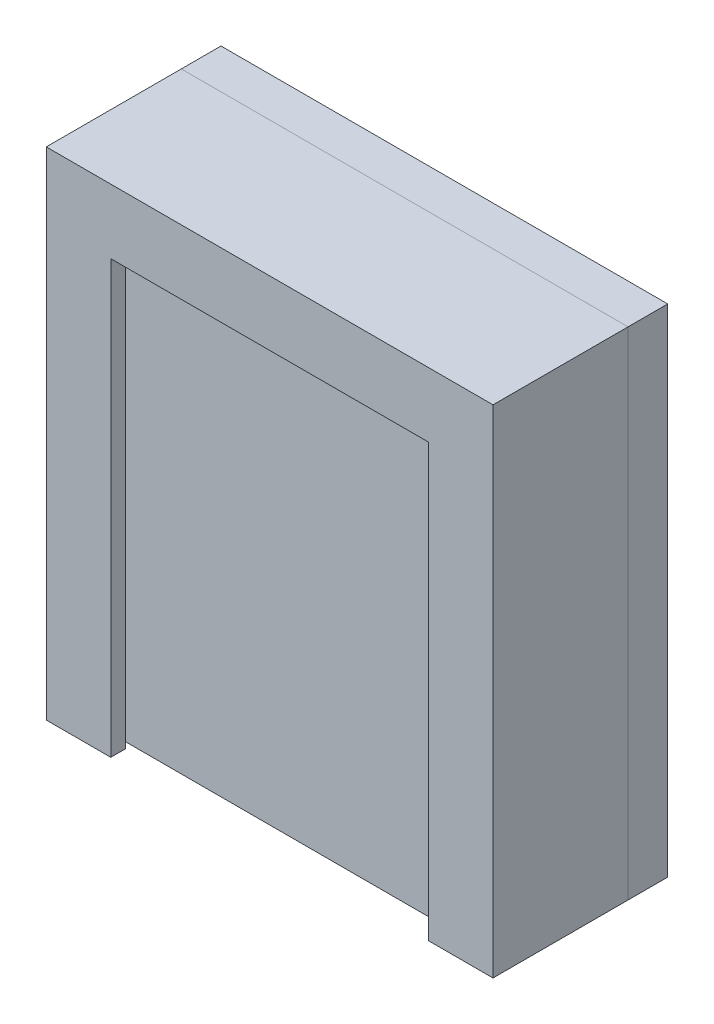
ISO-10303-21;
HEADER;
FILE_DESCRIPTION(('STEP AP214'),'2;1');
FILE_NAME('part.step','',(''),(''),'','','');
FILE_SCHEMA(('AUTOMOTIVE_DESIGN { 1 0 10303 214 1 1 1 1 }'));
ENDSEC;
DATA;
#1=APPLICATION_CONTEXT('core data for automotive mechanical design processes');
#2=APPLICATION_PROTOCOL_DEFINITION('international standard','automotive_design',2000,#1);
#3=PRODUCT_CONTEXT('',#1,'mechanical');
#4=PRODUCT('Part','Part','',(#3));
#5=PRODUCT_RELATED_PRODUCT_CATEGORY('part','',(#4));
#6=PRODUCT_DEFINITION_FORMATION('','',#4);
#7=PRODUCT_DEFINITION_CONTEXT('part definition',#1,'design');
#8=PRODUCT_DEFINITION('design','',#6,#7);
#9=PRODUCT_DEFINITION_SHAPE('','',#8);
#10=(LENGTH_UNIT() NAMED_UNIT(*) SI_UNIT(.MILLI.,.METRE.));
#11=(NAMED_UNIT(*) PLANE_ANGLE_UNIT() SI_UNIT($,.RADIAN.));
#12=(NAMED_UNIT(*) SI_UNIT($,.STERADIAN.) SOLID_ANGLE_UNIT());
#13=UNCERTAINTY_MEASURE_WITH_UNIT(LENGTH_MEASURE(1.E-05),#10,'distance_accuracy_value','');
#14=(GEOMETRIC_REPRESENTATION_CONTEXT(3) GLOBAL_UNCERTAINTY_ASSIGNED_CONTEXT((#13)) GLOBAL_UNIT_ASSIGNED_CONTEXT((#10,
#11,#12)) REPRESENTATION_CONTEXT('',''));
#15=CARTESIAN_POINT('',(0.,0.,0.));
#16=DIRECTION('',(0.,0.,1.));
#17=DIRECTION('',(1.,0.,0.));
#18=AXIS2_PLACEMENT_3D('',#15,#16,#17);
#19=CARTESIAN_POINT('',(42.5,0.,-22.));
#20=DIRECTION('',(-1.,0.,0.));
#21=DIRECTION('',(0.,0.,1.));
#22=AXIS2_PLACEMENT_3D('',#19,#20,#21);
#23=PLANE('',#22);
#24=DIRECTION('',(0.,-1.,0.));
#25=VECTOR('',#24,1.);
#26=CARTESIAN_POINT('',(42.5,0.,-18.));
#27=LINE('',#26,#25);
#28=CARTESIAN_POINT('',(42.5,47.5,-18.));
#29=VERTEX_POINT('',#28);
#30=CARTESIAN_POINT('',(42.5,-50.,-18.));
#31=VERTEX_POINT('',#30);
#32=EDGE_CURVE('E124',#29,#31,#27,.T.);
#33=ORIENTED_EDGE('',*,*,#32,.F.);
#34=DIRECTION('',(0.,0.,1.));
#35=VECTOR('',#34,1.);
#36=CARTESIAN_POINT('',(42.5,47.5,-22.));
#37=LINE('',#36,#35);
#38=CARTESIAN_POINT('',(42.5,47.5,-22.));
#39=VERTEX_POINT('',#38);
#40=EDGE_CURVE('E12',#39,#29,#37,.T.);
#41=ORIENTED_EDGE('',*,*,#40,.F.);
#42=DIRECTION('',(0.,-1.,0.));
#43=VECTOR('',#42,1.);
#44=CARTESIAN_POINT('',(42.5,0.,-22.));
#45=LINE('',#44,#43);
#46=CARTESIAN_POINT('',(42.5,-50.,-22.));
#47=VERTEX_POINT('',#46);
#48=EDGE_CURVE('E125',#39,#47,#45,.T.);
#49=ORIENTED_EDGE('',*,*,#48,.T.);
#50=DIRECTION('',(0.,0.,1.));
#51=VECTOR('',#50,1.);
#52=CARTESIAN_POINT('',(42.5,-50.,-22.));
#53=LINE('',#52,#51);
#54=EDGE_CURVE('E119',#47,#31,#53,.T.);
#55=ORIENTED_EDGE('',*,*,#54,.T.);
#56=EDGE_LOOP('',(#33,#41,#49,#55));
#57=FACE_BOUND('',#56,.T.);
#58=ADVANCED_FACE('F51',(#57),#23,.T.);
#59=CARTESIAN_POINT('',(0.,47.5,-22.));
#60=DIRECTION('',(0.,-1.,0.));
#61=DIRECTION('',(0.,0.,-1.));
#62=AXIS2_PLACEMENT_3D('',#59,#60,#61);
#63=PLANE('',#62);
#64=DIRECTION('',(1.,0.,0.));
#65=VECTOR('',#64,1.);
#66=CARTESIAN_POINT('',(0.,47.5,-18.));
#67=LINE('',#66,#65);
#68=CARTESIAN_POINT('',(-42.5,47.5,-18.));
#69=VERTEX_POINT('',#68);
#70=EDGE_CURVE('E139',#69,#29,#67,.T.);
#71=ORIENTED_EDGE('',*,*,#70,.F.);
#72=DIRECTION('',(0.,0.,1.));
#73=VECTOR('',#72,1.);
#74=CARTESIAN_POINT('',(-42.5,47.5,-22.));
#75=LINE('',#74,#73);
#76=CARTESIAN_POINT('',(-42.5,47.5,-22.));
#77=VERTEX_POINT('',#76);
#78=EDGE_CURVE('E59',#77,#69,#75,.T.);
#79=ORIENTED_EDGE('',*,*,#78,.F.);
#80=DIRECTION('',(1.,0.,0.));
#81=VECTOR('',#80,1.);
#82=CARTESIAN_POINT('',(0.,47.5,-22.));
#83=LINE('',#82,#81);
#84=EDGE_CURVE('E66',#77,#39,#83,.T.);
#85=ORIENTED_EDGE('',*,*,#84,.T.);
#86=ORIENTED_EDGE('',*,*,#40,.T.);
#87=EDGE_LOOP('',(#71,#79,#85,#86));
#88=FACE_BOUND('',#87,.T.);
#89=ADVANCED_FACE('F288',(#88),#63,.T.);
#90=CARTESIAN_POINT('',(-42.5,0.,-22.));
#91=DIRECTION('',(1.,0.,0.));
#92=DIRECTION('',(0.,0.,-1.));
#93=AXIS2_PLACEMENT_3D('',#90,#91,#92);
#94=PLANE('',#93);
#95=DIRECTION('',(0.,1.,0.));
#96=VECTOR('',#95,1.);
#97=CARTESIAN_POINT('',(-42.5,0.,-18.));
#98=LINE('',#97,#96);
#99=CARTESIAN_POINT('',(-42.5,-50.,-18.));
#100=VERTEX_POINT('',#99);
#101=EDGE_CURVE('E133',#100,#69,#98,.T.);
#102=ORIENTED_EDGE('',*,*,#101,.F.);
#103=DIRECTION('',(0.,0.,1.));
#104=VECTOR('',#103,1.);
#105=CARTESIAN_POINT('',(-42.5,-50.,-22.));
#106=LINE('',#105,#104);
#107=CARTESIAN_POINT('',(-42.5,-50.,-22.));
#108=VERTEX_POINT('',#107);
#109=EDGE_CURVE('E243',#108,#100,#106,.T.);
#110=ORIENTED_EDGE('',*,*,#109,.F.);
#111=DIRECTION('',(0.,1.,0.));
#112=VECTOR('',#111,1.);
#113=CARTESIAN_POINT('',(-42.5,0.,-22.));
#114=LINE('',#113,#112);
#115=EDGE_CURVE('E145',#108,#77,#114,.T.);
#116=ORIENTED_EDGE('',*,*,#115,.T.);
#117=ORIENTED_EDGE('',*,*,#78,.T.);
#118=EDGE_LOOP('',(#102,#110,#116,#117));
#119=FACE_BOUND('',#118,.T.);
#120=ADVANCED_FACE('F250',(#119),#94,.T.);
#121=CARTESIAN_POINT('',(0.,-50.,-22.));
#122=DIRECTION('',(0.,1.,0.));
#123=DIRECTION('',(0.,0.,1.));
#124=AXIS2_PLACEMENT_3D('',#121,#122,#123);
#125=PLANE('',#124);
#126=DIRECTION('',(-1.,0.,0.));
#127=VECTOR('',#126,1.);
#128=CARTESIAN_POINT('',(0.,-50.,-18.));
#129=LINE('',#128,#127);
#130=CARTESIAN_POINT('',(-45.,-50.,-18.));
#131=VERTEX_POINT('',#130);
#132=EDGE_CURVE('E127',#100,#131,#129,.T.);
#133=ORIENTED_EDGE('',*,*,#132,.T.);
#134=DIRECTION('',(0.,0.,1.));
#135=VECTOR('',#134,1.);
#136=CARTESIAN_POINT('',(-45.,-50.,-22.));
#137=LINE('',#136,#135);
#138=CARTESIAN_POINT('',(-45.,-50.,-26.));
#139=VERTEX_POINT('',#138);
#140=EDGE_CURVE('E251',#139,#131,#137,.T.);
#141=ORIENTED_EDGE('',*,*,#140,.F.);
#142=DIRECTION('',(-1.,0.,0.));
#143=VECTOR('',#142,1.);
#144=CARTESIAN_POINT('',(0.,-50.,-26.));
#145=LINE('',#144,#143);
#146=CARTESIAN_POINT('',(-42.5,-50.,-26.));
#147=VERTEX_POINT('',#146);
#148=EDGE_CURVE('E189',#147,#139,#145,.T.);
#149=ORIENTED_EDGE('',*,*,#148,.F.);
#150=DIRECTION('',(0.,0.,1.));
#151=VECTOR('',#150,1.);
#152=CARTESIAN_POINT('',(-42.5,-50.,-26.));
#153=LINE('',#152,#151);
#154=EDGE_CURVE('E163',#147,#108,#153,.T.);
#155=ORIENTED_EDGE('',*,*,#154,.T.);
#156=ORIENTED_EDGE('',*,*,#109,.T.);
#157=EDGE_LOOP('',(#133,#141,#149,#155,#156));
#158=FACE_BOUND('',#157,.T.);
#159=ADVANCED_FACE('F242',(#158),#125,.F.);
#160=CARTESIAN_POINT('',(-45.,0.,-22.));
#161=DIRECTION('',(1.,0.,0.));
#162=DIRECTION('',(0.,0.,-1.));
#163=AXIS2_PLACEMENT_3D('',#160,#161,#162);
#164=PLANE('',#163);
#165=DIRECTION('',(0.,1.,0.));
#166=VECTOR('',#165,1.);
#167=CARTESIAN_POINT('',(-45.,0.,-18.));
#168=LINE('',#167,#166);
#169=CARTESIAN_POINT('',(-45.,50.,-18.));
#170=VERTEX_POINT('',#169);
#171=EDGE_CURVE('E132',#131,#170,#168,.T.);
#172=ORIENTED_EDGE('',*,*,#171,.T.);
#173=DIRECTION('',(0.,0.,1.));
#174=VECTOR('',#173,1.);
#175=CARTESIAN_POINT('',(-45.,50.,-22.));
#176=LINE('',#175,#174);
#177=CARTESIAN_POINT('',(-45.,50.,-26.));
#178=VERTEX_POINT('',#177);
#179=EDGE_CURVE('E253',#178,#170,#176,.T.);
#180=ORIENTED_EDGE('',*,*,#179,.F.);
#181=DIRECTION('',(0.,1.,0.));
#182=VECTOR('',#181,1.);
#183=CARTESIAN_POINT('',(-45.,0.,-26.));
#184=LINE('',#183,#182);
#185=EDGE_CURVE('E186',#139,#178,#184,.T.);
#186=ORIENTED_EDGE('',*,*,#185,.F.);
#187=ORIENTED_EDGE('',*,*,#140,.T.);
#188=EDGE_LOOP('',(#172,#180,#186,#187));
#189=FACE_BOUND('',#188,.T.);
#190=ADVANCED_FACE('F267',(#189),#164,.F.);
#191=CARTESIAN_POINT('',(0.,50.,-22.));
#192=DIRECTION('',(0.,-1.,0.));
#193=DIRECTION('',(0.,0.,-1.));
#194=AXIS2_PLACEMENT_3D('',#191,#192,#193);
#195=PLANE('',#194);
#196=DIRECTION('',(1.,0.,0.));
#197=VECTOR('',#196,1.);
#198=CARTESIAN_POINT('',(0.,50.,-18.));
#199=LINE('',#198,#197);
#200=CARTESIAN_POINT('',(45.,50.,-18.));
#201=VERTEX_POINT('',#200);
#202=EDGE_CURVE('E108',#170,#201,#199,.T.);
#203=ORIENTED_EDGE('',*,*,#202,.T.);
#204=DIRECTION('',(0.,0.,1.));
#205=VECTOR('',#204,1.);
#206=CARTESIAN_POINT('',(45.,50.,-22.));
#207=LINE('',#206,#205);
#208=CARTESIAN_POINT('',(45.,50.,-26.));
#209=VERTEX_POINT('',#208);
#210=EDGE_CURVE('E103',#209,#201,#207,.T.);
#211=ORIENTED_EDGE('',*,*,#210,.F.);
#212=DIRECTION('',(1.,0.,0.));
#213=VECTOR('',#212,1.);
#214=CARTESIAN_POINT('',(0.,50.,-26.));
#215=LINE('',#214,#213);
#216=EDGE_CURVE('E183',#178,#209,#215,.T.);
#217=ORIENTED_EDGE('',*,*,#216,.F.);
#218=ORIENTED_EDGE('',*,*,#179,.T.);
#219=EDGE_LOOP('',(#203,#211,#217,#218));
#220=FACE_BOUND('',#219,.T.);
#221=ADVANCED_FACE('F261',(#220),#195,.F.);
#222=CARTESIAN_POINT('',(45.,0.,-22.));
#223=DIRECTION('',(-1.,0.,0.));
#224=DIRECTION('',(0.,0.,1.));
#225=AXIS2_PLACEMENT_3D('',#222,#223,#224);
#226=PLANE('',#225);
#227=DIRECTION('',(0.,-1.,0.));
#228=VECTOR('',#227,1.);
#229=CARTESIAN_POINT('',(45.,0.,-18.));
#230=LINE('',#229,#228);
#231=CARTESIAN_POINT('',(45.,-50.,-18.));
#232=VERTEX_POINT('',#231);
#233=EDGE_CURVE('E95',#201,#232,#230,.T.);
#234=ORIENTED_EDGE('',*,*,#233,.T.);
#235=DIRECTION('',(0.,0.,1.));
#236=VECTOR('',#235,1.);
#237=CARTESIAN_POINT('',(45.,-50.,-22.));
#238=LINE('',#237,#236);
#239=CARTESIAN_POINT('',(45.,-50.,-26.));
#240=VERTEX_POINT('',#239);
#241=EDGE_CURVE('E100',#240,#232,#238,.T.);
#242=ORIENTED_EDGE('',*,*,#241,.F.);
#243=DIRECTION('',(0.,-1.,0.));
#244=VECTOR('',#243,1.);
#245=CARTESIAN_POINT('',(45.,0.,-26.));
#246=LINE('',#245,#244);
#247=EDGE_CURVE('E166',#209,#240,#246,.T.);
#248=ORIENTED_EDGE('',*,*,#247,.F.);
#249=ORIENTED_EDGE('',*,*,#210,.T.);
#250=EDGE_LOOP('',(#234,#242,#248,#249));
#251=FACE_BOUND('',#250,.T.);
#252=ADVANCED_FACE('F97',(#251),#226,.F.);
#253=EDGE_CURVE('E107',#232,#31,#129,.T.);
#254=ORIENTED_EDGE('',*,*,#253,.T.);
#255=ORIENTED_EDGE('',*,*,#54,.F.);
#256=DIRECTION('',(0.,0.,1.));
#257=VECTOR('',#256,1.);
#258=CARTESIAN_POINT('',(42.5,-50.,-26.));
#259=LINE('',#258,#257);
#260=CARTESIAN_POINT('',(42.5,-50.,-26.));
#261=VERTEX_POINT('',#260);
#262=EDGE_CURVE('E144',#261,#47,#259,.T.);
#263=ORIENTED_EDGE('',*,*,#262,.F.);
#264=DIRECTION('',(-1.,0.,0.));
#265=VECTOR('',#264,1.);
#266=CARTESIAN_POINT('',(0.,-50.,-26.));
#267=LINE('',#266,#265);
#268=EDGE_CURVE('E118',#240,#261,#267,.T.);
#269=ORIENTED_EDGE('',*,*,#268,.F.);
#270=ORIENTED_EDGE('',*,*,#241,.T.);
#271=EDGE_LOOP('',(#254,#255,#263,#269,#270));
#272=FACE_BOUND('',#271,.T.);
#273=ADVANCED_FACE('F113',(#272),#125,.F.);
#274=CARTESIAN_POINT('',(0.,0.,-18.));
#275=DIRECTION('',(0.,0.,-1.));
#276=DIRECTION('',(-1.,0.,0.));
#277=AXIS2_PLACEMENT_3D('',#274,#275,#276);
#278=PLANE('',#277);
#279=ORIENTED_EDGE('',*,*,#32,.T.);
#280=ORIENTED_EDGE('',*,*,#253,.F.);
#281=ORIENTED_EDGE('',*,*,#233,.F.);
#282=ORIENTED_EDGE('',*,*,#202,.F.);
#283=ORIENTED_EDGE('',*,*,#171,.F.);
#284=ORIENTED_EDGE('',*,*,#132,.F.);
#285=ORIENTED_EDGE('',*,*,#101,.T.);
#286=ORIENTED_EDGE('',*,*,#70,.T.);
#287=EDGE_LOOP('',(#279,#280,#281,#282,#283,#284,#285,#286));
#288=FACE_BOUND('',#287,.T.);
#289=ADVANCED_FACE('F121',(#288),#278,.F.);
#290=CARTESIAN_POINT('',(14.0000000000001,7.00000000000002,-26.));
#291=DIRECTION('',(-0.894427190999916,-0.447213595499957,0.));
#292=DIRECTION('',(0.447213595499957,-0.894427190999916,0.));
#293=AXIS2_PLACEMENT_3D('',#290,#291,#292);
#294=PLANE('',#293);
#295=DIRECTION('',(0.447213595499957,-0.894427190999916,0.));
#296=VECTOR('',#295,1.);
#297=CARTESIAN_POINT('',(14.0000000000001,7.00000000000002,-22.));
#298=LINE('',#297,#296);
#299=CARTESIAN_POINT('',(40.,-45.,-22.));
#300=VERTEX_POINT('',#299);
#301=EDGE_CURVE('E179',#300,#47,#298,.T.);
#302=ORIENTED_EDGE('',*,*,#301,.F.);
#303=DIRECTION('',(0.,0.,1.));
#304=VECTOR('',#303,1.);
#305=CARTESIAN_POINT('',(40.,-45.,-26.));
#306=LINE('',#305,#304);
#307=CARTESIAN_POINT('',(40.,-45.,-26.));
#308=VERTEX_POINT('',#307);
#309=EDGE_CURVE('E151',#308,#300,#306,.T.);
#310=ORIENTED_EDGE('',*,*,#309,.F.);
#311=DIRECTION('',(0.447213595499957,-0.894427190999916,0.));
#312=VECTOR('',#311,1.);
#313=CARTESIAN_POINT('',(14.0000000000001,7.00000000000002,-26.));
#314=LINE('',#313,#312);
#315=EDGE_CURVE('E204',#308,#261,#314,.T.);
#316=ORIENTED_EDGE('',*,*,#315,.T.);
#317=ORIENTED_EDGE('',*,*,#262,.T.);
#318=EDGE_LOOP('',(#302,#310,#316,#317));
#319=FACE_BOUND('',#318,.T.);
#320=ADVANCED_FACE('F219',(#319),#294,.T.);
#321=CARTESIAN_POINT('',(40.,0.,-26.));
#322=DIRECTION('',(-1.,0.,0.));
#323=DIRECTION('',(0.,-1.,0.));
#324=AXIS2_PLACEMENT_3D('',#321,#322,#323);
#325=PLANE('',#324);
#326=DIRECTION('',(0.,-1.,0.));
#327=VECTOR('',#326,1.);
#328=CARTESIAN_POINT('',(40.,0.,-22.));
#329=LINE('',#328,#327);
#330=CARTESIAN_POINT('',(40.,45.,-22.));
#331=VERTEX_POINT('',#330);
#332=EDGE_CURVE('E176',#331,#300,#329,.T.);
#333=ORIENTED_EDGE('',*,*,#332,.F.);
#334=DIRECTION('',(0.,0.,1.));
#335=VECTOR('',#334,1.);
#336=CARTESIAN_POINT('',(40.,45.,-26.));
#337=LINE('',#336,#335);
#338=CARTESIAN_POINT('',(40.,45.,-26.));
#339=VERTEX_POINT('',#338);
#340=EDGE_CURVE('E154',#339,#331,#337,.T.);
#341=ORIENTED_EDGE('',*,*,#340,.F.);
#342=DIRECTION('',(0.,-1.,0.));
#343=VECTOR('',#342,1.);
#344=CARTESIAN_POINT('',(40.,0.,-26.));
#345=LINE('',#344,#343);
#346=EDGE_CURVE('E201',#339,#308,#345,.T.);
#347=ORIENTED_EDGE('',*,*,#346,.T.);
#348=ORIENTED_EDGE('',*,*,#309,.T.);
#349=EDGE_LOOP('',(#333,#341,#347,#348));
#350=FACE_BOUND('',#349,.T.);
#351=ADVANCED_FACE('F225',(#350),#325,.T.);
#352=CARTESIAN_POINT('',(0.,45.,-26.));
#353=DIRECTION('',(0.,-1.,0.));
#354=DIRECTION('',(0.,0.,-1.));
#355=AXIS2_PLACEMENT_3D('',#352,#353,#354);
#356=PLANE('',#355);
#357=DIRECTION('',(1.,0.,0.));
#358=VECTOR('',#357,1.);
#359=CARTESIAN_POINT('',(0.,45.,-22.));
#360=LINE('',#359,#358);
#361=CARTESIAN_POINT('',(-40.,45.,-22.));
#362=VERTEX_POINT('',#361);
#363=EDGE_CURVE('E173',#362,#331,#360,.T.);
#364=ORIENTED_EDGE('',*,*,#363,.F.);
#365=DIRECTION('',(0.,0.,1.));
#366=VECTOR('',#365,1.);
#367=CARTESIAN_POINT('',(-40.,45.,-26.));
#368=LINE('',#367,#366);
#369=CARTESIAN_POINT('',(-40.,45.,-26.));
#370=VERTEX_POINT('',#369);
#371=EDGE_CURVE('E157',#370,#362,#368,.T.);
#372=ORIENTED_EDGE('',*,*,#371,.F.);
#373=DIRECTION('',(1.,0.,0.));
#374=VECTOR('',#373,1.);
#375=CARTESIAN_POINT('',(0.,45.,-26.));
#376=LINE('',#375,#374);
#377=EDGE_CURVE('E198',#370,#339,#376,.T.);
#378=ORIENTED_EDGE('',*,*,#377,.T.);
#379=ORIENTED_EDGE('',*,*,#340,.T.);
#380=EDGE_LOOP('',(#364,#372,#378,#379));
#381=FACE_BOUND('',#380,.T.);
#382=ADVANCED_FACE('F310',(#381),#356,.T.);
#383=CARTESIAN_POINT('',(-40.,0.,-26.));
#384=DIRECTION('',(1.,0.,0.));
#385=DIRECTION('',(0.,0.,-1.));
#386=AXIS2_PLACEMENT_3D('',#383,#384,#385);
#387=PLANE('',#386);
#388=DIRECTION('',(0.,1.,0.));
#389=VECTOR('',#388,1.);
#390=CARTESIAN_POINT('',(-40.,0.,-22.));
#391=LINE('',#390,#389);
#392=CARTESIAN_POINT('',(-40.,-45.,-22.));
#393=VERTEX_POINT('',#392);
#394=EDGE_CURVE('E170',#393,#362,#391,.T.);
#395=ORIENTED_EDGE('',*,*,#394,.F.);
#396=DIRECTION('',(0.,0.,1.));
#397=VECTOR('',#396,1.);
#398=CARTESIAN_POINT('',(-40.,-45.,-26.));
#399=LINE('',#398,#397);
#400=CARTESIAN_POINT('',(-40.,-45.,-26.));
#401=VERTEX_POINT('',#400);
#402=EDGE_CURVE('E160',#401,#393,#399,.T.);
#403=ORIENTED_EDGE('',*,*,#402,.F.);
#404=DIRECTION('',(0.,1.,0.));
#405=VECTOR('',#404,1.);
#406=CARTESIAN_POINT('',(-40.,0.,-26.));
#407=LINE('',#406,#405);
#408=EDGE_CURVE('E195',#401,#370,#407,.T.);
#409=ORIENTED_EDGE('',*,*,#408,.T.);
#410=ORIENTED_EDGE('',*,*,#371,.T.);
#411=EDGE_LOOP('',(#395,#403,#409,#410));
#412=FACE_BOUND('',#411,.T.);
#413=ADVANCED_FACE('F313',(#412),#387,.T.);
#414=CARTESIAN_POINT('',(-14.,7.00000000000001,-26.));
#415=DIRECTION('',(0.894427190999916,-0.447213595499957,0.));
#416=DIRECTION('',(0.447213595499957,0.894427190999916,0.));
#417=AXIS2_PLACEMENT_3D('',#414,#415,#416);
#418=PLANE('',#417);
#419=DIRECTION('',(0.447213595499957,0.894427190999916,0.));
#420=VECTOR('',#419,1.);
#421=CARTESIAN_POINT('',(-14.,7.00000000000001,-22.));
#422=LINE('',#421,#420);
#423=EDGE_CURVE('E167',#108,#393,#422,.T.);
#424=ORIENTED_EDGE('',*,*,#423,.F.);
#425=ORIENTED_EDGE('',*,*,#154,.F.);
#426=DIRECTION('',(0.447213595499957,0.894427190999916,0.));
#427=VECTOR('',#426,1.);
#428=CARTESIAN_POINT('',(-14.,7.00000000000001,-26.));
#429=LINE('',#428,#427);
#430=EDGE_CURVE('E192',#147,#401,#429,.T.);
#431=ORIENTED_EDGE('',*,*,#430,.T.);
#432=ORIENTED_EDGE('',*,*,#402,.T.);
#433=EDGE_LOOP('',(#424,#425,#431,#432));
#434=FACE_BOUND('',#433,.T.);
#435=ADVANCED_FACE('F247',(#434),#418,.T.);
#436=CARTESIAN_POINT('',(0.,0.,-26.));
#437=DIRECTION('',(0.,0.,-1.));
#438=DIRECTION('',(-1.,0.,0.));
#439=AXIS2_PLACEMENT_3D('',#436,#437,#438);
#440=PLANE('',#439);
#441=ORIENTED_EDGE('',*,*,#268,.T.);
#442=ORIENTED_EDGE('',*,*,#315,.F.);
#443=ORIENTED_EDGE('',*,*,#346,.F.);
#444=ORIENTED_EDGE('',*,*,#377,.F.);
#445=ORIENTED_EDGE('',*,*,#408,.F.);
#446=ORIENTED_EDGE('',*,*,#430,.F.);
#447=ORIENTED_EDGE('',*,*,#148,.T.);
#448=ORIENTED_EDGE('',*,*,#185,.T.);
#449=ORIENTED_EDGE('',*,*,#216,.T.);
#450=ORIENTED_EDGE('',*,*,#247,.T.);
#451=EDGE_LOOP('',(#441,#442,#443,#444,#445,#446,#447,#448,#449,#450));
#452=FACE_BOUND('',#451,.T.);
#453=ADVANCED_FACE('F210',(#452),#440,.T.);
#454=CARTESIAN_POINT('',(0.,0.,-22.));
#455=DIRECTION('',(0.,0.,-1.));
#456=DIRECTION('',(-1.,0.,0.));
#457=AXIS2_PLACEMENT_3D('',#454,#455,#456);
#458=PLANE('',#457);
#459=ORIENTED_EDGE('',*,*,#48,.F.);
#460=ORIENTED_EDGE('',*,*,#84,.F.);
#461=ORIENTED_EDGE('',*,*,#115,.F.);
#462=ORIENTED_EDGE('',*,*,#423,.T.);
#463=ORIENTED_EDGE('',*,*,#394,.T.);
#464=ORIENTED_EDGE('',*,*,#363,.T.);
#465=ORIENTED_EDGE('',*,*,#332,.T.);
#466=ORIENTED_EDGE('',*,*,#301,.T.);
#467=EDGE_LOOP('',(#459,#460,#461,#462,#463,#464,#465,#466));
#468=FACE_BOUND('',#467,.T.);
#469=ADVANCED_FACE('F236',(#468),#458,.F.);
#470=CLOSED_SHELL('',(#58,#89,#120,#159,#190,#221,#252,#273,#289,#320,#351,#382,#413,#435,#453,#469));
#471=MANIFOLD_SOLID_BREP('B2',#470);
#472=CARTESIAN_POINT('',(0.,0.,5.));
#473=DIRECTION('',(0.,0.,1.));
#474=DIRECTION('',(1.,0.,0.));
#475=AXIS2_PLACEMENT_3D('',#472,#473,#474);
#476=PLANE('',#475);
#477=DIRECTION('',(-1.,0.,0.));
#478=VECTOR('',#477,1.);
#479=CARTESIAN_POINT('',(0.,42.,5.));
#480=LINE('',#479,#478);
#481=CARTESIAN_POINT('',(37.,42.,5.));
#482=VERTEX_POINT('',#481);
#483=CARTESIAN_POINT('',(-37.,42.,5.));
#484=VERTEX_POINT('',#483);
#485=EDGE_CURVE('E500',#482,#484,#480,.T.);
#486=ORIENTED_EDGE('',*,*,#485,.T.);
#487=DIRECTION('',(0.,-1.,0.));
#488=VECTOR('',#487,1.);
#489=CARTESIAN_POINT('',(-37.,0.,5.));
#490=LINE('',#489,#488);
#491=CARTESIAN_POINT('',(-37.,-50.,5.));
#492=VERTEX_POINT('',#491);
#493=EDGE_CURVE('E527',#484,#492,#490,.T.);
#494=ORIENTED_EDGE('',*,*,#493,.T.);
#495=DIRECTION('',(1.,0.,0.));
#496=VECTOR('',#495,1.);
#497=CARTESIAN_POINT('',(45.,-50.,5.));
#498=LINE('',#497,#496);
#499=CARTESIAN_POINT('',(37.,-50.,5.));
#500=VERTEX_POINT('',#499);
#501=EDGE_CURVE('E538',#492,#500,#498,.T.);
#502=ORIENTED_EDGE('',*,*,#501,.T.);
#503=DIRECTION('',(0.,1.,0.));
#504=VECTOR('',#503,1.);
#505=CARTESIAN_POINT('',(37.,0.,5.));
#506=LINE('',#505,#504);
#507=EDGE_CURVE('E541',#500,#482,#506,.T.);
#508=ORIENTED_EDGE('',*,*,#507,.T.);
#509=EDGE_LOOP('',(#486,#494,#502,#508));
#510=FACE_BOUND('',#509,.T.);
#511=ADVANCED_FACE('F484',(#510),#476,.T.);
#512=CARTESIAN_POINT('',(-45.,-50.,5.));
#513=DIRECTION('',(1.,0.,0.));
#514=DIRECTION('',(0.,0.,-1.));
#515=AXIS2_PLACEMENT_3D('',#512,#513,#514);
#516=PLANE('',#515);
#517=DIRECTION('',(0.,0.,-1.));
#518=VECTOR('',#517,1.);
#519=CARTESIAN_POINT('',(-45.,50.,5.));
#520=LINE('',#519,#518);
#521=CARTESIAN_POINT('',(-45.,50.,9.2));
#522=VERTEX_POINT('',#521);
#523=CARTESIAN_POINT('',(-45.,50.,-18.));
#524=VERTEX_POINT('',#523);
#525=EDGE_CURVE('E549',#522,#524,#520,.T.);
#526=ORIENTED_EDGE('',*,*,#525,.T.);
#527=DIRECTION('',(0.,1.,0.));
#528=VECTOR('',#527,1.);
#529=CARTESIAN_POINT('',(-45.,50.,-18.));
#530=LINE('',#529,#528);
#531=CARTESIAN_POINT('',(-45.,-50.,-18.));
#532=VERTEX_POINT('',#531);
#533=EDGE_CURVE('E593',#532,#524,#530,.T.);
#534=ORIENTED_EDGE('',*,*,#533,.F.);
#535=DIRECTION('',(0.,0.,-1.));
#536=VECTOR('',#535,1.);
#537=CARTESIAN_POINT('',(-45.,-50.,5.));
#538=LINE('',#537,#536);
#539=CARTESIAN_POINT('',(-45.,-50.,9.2));
#540=VERTEX_POINT('',#539);
#541=EDGE_CURVE('E49',#540,#532,#538,.T.);
#542=ORIENTED_EDGE('',*,*,#541,.F.);
#543=DIRECTION('',(0.,-1.,0.));
#544=VECTOR('',#543,1.);
#545=CARTESIAN_POINT('',(-45.,50.,9.2));
#546=LINE('',#545,#544);
#547=EDGE_CURVE('E617',#522,#540,#546,.T.);
#548=ORIENTED_EDGE('',*,*,#547,.F.);
#549=EDGE_LOOP('',(#526,#534,#542,#548));
#550=FACE_BOUND('',#549,.T.);
#551=ADVANCED_FACE('F486',(#550),#516,.F.);
#552=CARTESIAN_POINT('',(45.,-50.,5.));
#553=DIRECTION('',(0.,1.,0.));
#554=DIRECTION('',(-1.,0.,0.));
#555=AXIS2_PLACEMENT_3D('',#552,#553,#554);
#556=PLANE('',#555);
#557=DIRECTION('',(-1.,0.,0.));
#558=VECTOR('',#557,1.);
#559=CARTESIAN_POINT('',(-45.,-50.,-18.));
#560=LINE('',#559,#558);
#561=CARTESIAN_POINT('',(-40.,-50.,-18.));
#562=VERTEX_POINT('',#561);
#563=EDGE_CURVE('E594',#562,#532,#560,.T.);
#564=ORIENTED_EDGE('',*,*,#563,.F.);
#565=DIRECTION('',(0.,0.,1.));
#566=VECTOR('',#565,1.);
#567=CARTESIAN_POINT('',(-40.,-50.,5.));
#568=LINE('',#567,#566);
#569=CARTESIAN_POINT('',(-40.,-50.,0.));
#570=VERTEX_POINT('',#569);
#571=EDGE_CURVE('E758',#562,#570,#568,.T.);
#572=ORIENTED_EDGE('',*,*,#571,.T.);
#573=DIRECTION('',(1.,0.,0.));
#574=VECTOR('',#573,1.);
#575=CARTESIAN_POINT('',(45.,-50.,0.));
#576=LINE('',#575,#574);
#577=CARTESIAN_POINT('',(40.,-50.,0.));
#578=VERTEX_POINT('',#577);
#579=EDGE_CURVE('E765',#570,#578,#576,.T.);
#580=ORIENTED_EDGE('',*,*,#579,.T.);
#581=DIRECTION('',(0.,0.,-1.));
#582=VECTOR('',#581,1.);
#583=CARTESIAN_POINT('',(40.,-50.,5.));
#584=LINE('',#583,#582);
#585=CARTESIAN_POINT('',(40.,-50.,-18.));
#586=VERTEX_POINT('',#585);
#587=EDGE_CURVE('E589',#578,#586,#584,.T.);
#588=ORIENTED_EDGE('',*,*,#587,.T.);
#589=CARTESIAN_POINT('',(45.,-50.,-18.));
#590=VERTEX_POINT('',#589);
#591=EDGE_CURVE('E585',#590,#586,#560,.T.);
#592=ORIENTED_EDGE('',*,*,#591,.F.);
#593=DIRECTION('',(0.,0.,-1.));
#594=VECTOR('',#593,1.);
#595=CARTESIAN_POINT('',(45.,-50.,5.));
#596=LINE('',#595,#594);
#597=CARTESIAN_POINT('',(45.,-50.,9.2));
#598=VERTEX_POINT('',#597);
#599=EDGE_CURVE('E493',#598,#590,#596,.T.);
#600=ORIENTED_EDGE('',*,*,#599,.F.);
#601=DIRECTION('',(1.,0.,0.));
#602=VECTOR('',#601,1.);
#603=CARTESIAN_POINT('',(32.,-50.,9.2));
#604=LINE('',#603,#602);
#605=CARTESIAN_POINT('',(32.,-50.,9.2));
#606=VERTEX_POINT('',#605);
#607=EDGE_CURVE('E638',#606,#598,#604,.T.);
#608=ORIENTED_EDGE('',*,*,#607,.F.);
#609=DIRECTION('',(0.,0.,-1.));
#610=VECTOR('',#609,1.);
#611=CARTESIAN_POINT('',(32.,-50.,9.2));
#612=LINE('',#611,#610);
#613=CARTESIAN_POINT('',(32.,-50.,6.2));
#614=VERTEX_POINT('',#613);
#615=EDGE_CURVE('E647',#606,#614,#612,.T.);
#616=ORIENTED_EDGE('',*,*,#615,.T.);
#617=DIRECTION('',(1.,0.,0.));
#618=VECTOR('',#617,1.);
#619=CARTESIAN_POINT('',(37.,-50.,6.2));
#620=LINE('',#619,#618);
#621=CARTESIAN_POINT('',(37.,-50.,6.2));
#622=VERTEX_POINT('',#621);
#623=EDGE_CURVE('E622',#614,#622,#620,.T.);
#624=ORIENTED_EDGE('',*,*,#623,.T.);
#625=DIRECTION('',(0.,0.,-1.));
#626=VECTOR('',#625,1.);
#627=CARTESIAN_POINT('',(37.,-50.,6.2));
#628=LINE('',#627,#626);
#629=EDGE_CURVE('E532',#622,#500,#628,.T.);
#630=ORIENTED_EDGE('',*,*,#629,.T.);
#631=ORIENTED_EDGE('',*,*,#501,.F.);
#632=DIRECTION('',(0.,0.,-1.));
#633=VECTOR('',#632,1.);
#634=CARTESIAN_POINT('',(-37.,-50.,6.2));
#635=LINE('',#634,#633);
#636=CARTESIAN_POINT('',(-37.,-50.,6.2));
#637=VERTEX_POINT('',#636);
#638=EDGE_CURVE('E523',#637,#492,#635,.T.);
#639=ORIENTED_EDGE('',*,*,#638,.F.);
#640=DIRECTION('',(1.,0.,0.));
#641=VECTOR('',#640,1.);
#642=CARTESIAN_POINT('',(-37.,-50.,6.2));
#643=LINE('',#642,#641);
#644=CARTESIAN_POINT('',(-32.,-50.,6.2));
#645=VERTEX_POINT('',#644);
#646=EDGE_CURVE('E509',#637,#645,#643,.T.);
#647=ORIENTED_EDGE('',*,*,#646,.T.);
#648=DIRECTION('',(0.,0.,-1.));
#649=VECTOR('',#648,1.);
#650=CARTESIAN_POINT('',(-32.,-50.,9.2));
#651=LINE('',#650,#649);
#652=CARTESIAN_POINT('',(-32.,-50.,9.2));
#653=VERTEX_POINT('',#652);
#654=EDGE_CURVE('E675',#653,#645,#651,.T.);
#655=ORIENTED_EDGE('',*,*,#654,.F.);
#656=DIRECTION('',(1.,0.,0.));
#657=VECTOR('',#656,1.);
#658=CARTESIAN_POINT('',(-45.,-50.,9.2));
#659=LINE('',#658,#657);
#660=EDGE_CURVE('E621',#540,#653,#659,.T.);
#661=ORIENTED_EDGE('',*,*,#660,.F.);
#662=ORIENTED_EDGE('',*,*,#541,.T.);
#663=EDGE_LOOP('',(#564,#572,#580,#588,#592,#600,#608,#616,#624,#630,#631,#639,#647,#655,#661,#662));
#664=FACE_BOUND('',#663,.T.);
#665=ADVANCED_FACE('F544',(#664),#556,.F.);
#666=CARTESIAN_POINT('',(45.,-50.,5.));
#667=DIRECTION('',(-1.,0.,0.));
#668=DIRECTION('',(0.,0.,1.));
#669=AXIS2_PLACEMENT_3D('',#666,#667,#668);
#670=PLANE('',#669);
#671=ORIENTED_EDGE('',*,*,#599,.T.);
#672=DIRECTION('',(0.,-1.,0.));
#673=VECTOR('',#672,1.);
#674=CARTESIAN_POINT('',(45.,50.,-18.));
#675=LINE('',#674,#673);
#676=CARTESIAN_POINT('',(45.,50.,-18.));
#677=VERTEX_POINT('',#676);
#678=EDGE_CURVE('E574',#677,#590,#675,.T.);
#679=ORIENTED_EDGE('',*,*,#678,.F.);
#680=DIRECTION('',(0.,0.,-1.));
#681=VECTOR('',#680,1.);
#682=CARTESIAN_POINT('',(45.,50.,5.));
#683=LINE('',#682,#681);
#684=CARTESIAN_POINT('',(45.,50.,9.2));
#685=VERTEX_POINT('',#684);
#686=EDGE_CURVE('E555',#685,#677,#683,.T.);
#687=ORIENTED_EDGE('',*,*,#686,.F.);
#688=DIRECTION('',(0.,1.,0.));
#689=VECTOR('',#688,1.);
#690=CARTESIAN_POINT('',(45.,-50.,9.2));
#691=LINE('',#690,#689);
#692=EDGE_CURVE('E577',#598,#685,#691,.T.);
#693=ORIENTED_EDGE('',*,*,#692,.F.);
#694=EDGE_LOOP('',(#671,#679,#687,#693));
#695=FACE_BOUND('',#694,.T.);
#696=ADVANCED_FACE('F570',(#695),#670,.F.);
#697=CARTESIAN_POINT('',(45.,50.,5.));
#698=DIRECTION('',(0.,-1.,0.));
#699=DIRECTION('',(1.,0.,0.));
#700=AXIS2_PLACEMENT_3D('',#697,#698,#699);
#701=PLANE('',#700);
#702=ORIENTED_EDGE('',*,*,#686,.T.);
#703=DIRECTION('',(1.,0.,0.));
#704=VECTOR('',#703,1.);
#705=CARTESIAN_POINT('',(-45.,50.,-18.));
#706=LINE('',#705,#704);
#707=EDGE_CURVE('E601',#524,#677,#706,.T.);
#708=ORIENTED_EDGE('',*,*,#707,.F.);
#709=ORIENTED_EDGE('',*,*,#525,.F.);
#710=DIRECTION('',(-1.,0.,0.));
#711=VECTOR('',#710,1.);
#712=CARTESIAN_POINT('',(45.,50.,9.2));
#713=LINE('',#712,#711);
#714=EDGE_CURVE('E643',#685,#522,#713,.T.);
#715=ORIENTED_EDGE('',*,*,#714,.F.);
#716=EDGE_LOOP('',(#702,#708,#709,#715));
#717=FACE_BOUND('',#716,.T.);
#718=ADVANCED_FACE('F802',(#717),#701,.F.);
#719=CARTESIAN_POINT('',(0.,42.,6.2));
#720=DIRECTION('',(0.,-1.,0.));
#721=DIRECTION('',(1.,0.,0.));
#722=AXIS2_PLACEMENT_3D('',#719,#720,#721);
#723=PLANE('',#722);
#724=ORIENTED_EDGE('',*,*,#485,.F.);
#725=DIRECTION('',(0.,0.,-1.));
#726=VECTOR('',#725,1.);
#727=CARTESIAN_POINT('',(37.,42.,6.2));
#728=LINE('',#727,#726);
#729=CARTESIAN_POINT('',(37.,42.,6.2));
#730=VERTEX_POINT('',#729);
#731=EDGE_CURVE('E550',#730,#482,#728,.T.);
#732=ORIENTED_EDGE('',*,*,#731,.F.);
#733=DIRECTION('',(-1.,0.,0.));
#734=VECTOR('',#733,1.);
#735=CARTESIAN_POINT('',(0.,42.,6.2));
#736=LINE('',#735,#734);
#737=CARTESIAN_POINT('',(-37.,42.,6.2));
#738=VERTEX_POINT('',#737);
#739=EDGE_CURVE('E540',#730,#738,#736,.T.);
#740=ORIENTED_EDGE('',*,*,#739,.T.);
#741=DIRECTION('',(0.,0.,-1.));
#742=VECTOR('',#741,1.);
#743=CARTESIAN_POINT('',(-37.,42.,6.2));
#744=LINE('',#743,#742);
#745=EDGE_CURVE('E533',#738,#484,#744,.T.);
#746=ORIENTED_EDGE('',*,*,#745,.T.);
#747=EDGE_LOOP('',(#724,#732,#740,#746));
#748=FACE_BOUND('',#747,.T.);
#749=ADVANCED_FACE('F694',(#748),#723,.T.);
#750=CARTESIAN_POINT('',(37.,0.,6.2));
#751=DIRECTION('',(-1.,0.,0.));
#752=DIRECTION('',(0.,0.,1.));
#753=AXIS2_PLACEMENT_3D('',#750,#751,#752);
#754=PLANE('',#753);
#755=ORIENTED_EDGE('',*,*,#507,.F.);
#756=ORIENTED_EDGE('',*,*,#629,.F.);
#757=DIRECTION('',(0.,1.,0.));
#758=VECTOR('',#757,1.);
#759=CARTESIAN_POINT('',(37.,0.,6.2));
#760=LINE('',#759,#758);
#761=EDGE_CURVE('E682',#622,#730,#760,.T.);
#762=ORIENTED_EDGE('',*,*,#761,.T.);
#763=ORIENTED_EDGE('',*,*,#731,.T.);
#764=EDGE_LOOP('',(#755,#756,#762,#763));
#765=FACE_BOUND('',#764,.T.);
#766=ADVANCED_FACE('F814',(#765),#754,.T.);
#767=CARTESIAN_POINT('',(-37.,0.,6.2));
#768=DIRECTION('',(1.,0.,0.));
#769=DIRECTION('',(0.,0.,-1.));
#770=AXIS2_PLACEMENT_3D('',#767,#768,#769);
#771=PLANE('',#770);
#772=ORIENTED_EDGE('',*,*,#493,.F.);
#773=ORIENTED_EDGE('',*,*,#745,.F.);
#774=DIRECTION('',(0.,-1.,0.));
#775=VECTOR('',#774,1.);
#776=CARTESIAN_POINT('',(-37.,0.,6.2));
#777=LINE('',#776,#775);
#778=EDGE_CURVE('E528',#738,#637,#777,.T.);
#779=ORIENTED_EDGE('',*,*,#778,.T.);
#780=ORIENTED_EDGE('',*,*,#638,.T.);
#781=EDGE_LOOP('',(#772,#773,#779,#780));
#782=FACE_BOUND('',#781,.T.);
#783=ADVANCED_FACE('F525',(#782),#771,.T.);
#784=CARTESIAN_POINT('',(-32.,-50.,9.2));
#785=DIRECTION('',(-1.,0.,0.));
#786=DIRECTION('',(0.,0.,1.));
#787=AXIS2_PLACEMENT_3D('',#784,#785,#786);
#788=PLANE('',#787);
#789=DIRECTION('',(0.,1.,0.));
#790=VECTOR('',#789,1.);
#791=CARTESIAN_POINT('',(-32.,-50.,6.2));
#792=LINE('',#791,#790);
#793=CARTESIAN_POINT('',(-32.,37.,6.2));
#794=VERTEX_POINT('',#793);
#795=EDGE_CURVE('E650',#645,#794,#792,.T.);
#796=ORIENTED_EDGE('',*,*,#795,.T.);
#797=DIRECTION('',(0.,0.,-1.));
#798=VECTOR('',#797,1.);
#799=CARTESIAN_POINT('',(-32.,37.,9.2));
#800=LINE('',#799,#798);
#801=CARTESIAN_POINT('',(-32.,37.,9.2));
#802=VERTEX_POINT('',#801);
#803=EDGE_CURVE('E671',#802,#794,#800,.T.);
#804=ORIENTED_EDGE('',*,*,#803,.F.);
#805=DIRECTION('',(0.,1.,0.));
#806=VECTOR('',#805,1.);
#807=CARTESIAN_POINT('',(-32.,-50.,9.2));
#808=LINE('',#807,#806);
#809=EDGE_CURVE('E626',#653,#802,#808,.T.);
#810=ORIENTED_EDGE('',*,*,#809,.F.);
#811=ORIENTED_EDGE('',*,*,#654,.T.);
#812=EDGE_LOOP('',(#796,#804,#810,#811));
#813=FACE_BOUND('',#812,.T.);
#814=ADVANCED_FACE('F821',(#813),#788,.F.);
#815=CARTESIAN_POINT('',(-32.,37.,9.2));
#816=DIRECTION('',(0.,1.,0.));
#817=DIRECTION('',(0.,0.,1.));
#818=AXIS2_PLACEMENT_3D('',#815,#816,#817);
#819=PLANE('',#818);
#820=DIRECTION('',(1.,0.,0.));
#821=VECTOR('',#820,1.);
#822=CARTESIAN_POINT('',(-32.,37.,6.2));
#823=LINE('',#822,#821);
#824=CARTESIAN_POINT('',(32.,37.,6.2));
#825=VERTEX_POINT('',#824);
#826=EDGE_CURVE('E654',#794,#825,#823,.T.);
#827=ORIENTED_EDGE('',*,*,#826,.T.);
#828=DIRECTION('',(0.,0.,-1.));
#829=VECTOR('',#828,1.);
#830=CARTESIAN_POINT('',(32.,37.,9.2));
#831=LINE('',#830,#829);
#832=CARTESIAN_POINT('',(32.,37.,9.2));
#833=VERTEX_POINT('',#832);
#834=EDGE_CURVE('E667',#833,#825,#831,.T.);
#835=ORIENTED_EDGE('',*,*,#834,.F.);
#836=DIRECTION('',(1.,0.,0.));
#837=VECTOR('',#836,1.);
#838=CARTESIAN_POINT('',(-32.,37.,9.2));
#839=LINE('',#838,#837);
#840=EDGE_CURVE('E630',#802,#833,#839,.T.);
#841=ORIENTED_EDGE('',*,*,#840,.F.);
#842=ORIENTED_EDGE('',*,*,#803,.T.);
#843=EDGE_LOOP('',(#827,#835,#841,#842));
#844=FACE_BOUND('',#843,.T.);
#845=ADVANCED_FACE('F879',(#844),#819,.F.);
#846=CARTESIAN_POINT('',(32.,37.,9.2));
#847=DIRECTION('',(1.,0.,0.));
#848=DIRECTION('',(0.,1.,0.));
#849=AXIS2_PLACEMENT_3D('',#846,#847,#848);
#850=PLANE('',#849);
#851=DIRECTION('',(0.,-1.,0.));
#852=VECTOR('',#851,1.);
#853=CARTESIAN_POINT('',(32.,37.,6.2));
#854=LINE('',#853,#852);
#855=EDGE_CURVE('E658',#825,#614,#854,.T.);
#856=ORIENTED_EDGE('',*,*,#855,.T.);
#857=ORIENTED_EDGE('',*,*,#615,.F.);
#858=DIRECTION('',(0.,-1.,0.));
#859=VECTOR('',#858,1.);
#860=CARTESIAN_POINT('',(32.,37.,9.2));
#861=LINE('',#860,#859);
#862=EDGE_CURVE('E634',#833,#606,#861,.T.);
#863=ORIENTED_EDGE('',*,*,#862,.F.);
#864=ORIENTED_EDGE('',*,*,#834,.T.);
#865=EDGE_LOOP('',(#856,#857,#863,#864));
#866=FACE_BOUND('',#865,.T.);
#867=ADVANCED_FACE('F808',(#866),#850,.F.);
#868=CARTESIAN_POINT('',(0.,0.,9.2));
#869=DIRECTION('',(0.,0.,1.));
#870=DIRECTION('',(1.,0.,0.));
#871=AXIS2_PLACEMENT_3D('',#868,#869,#870);
#872=PLANE('',#871);
#873=ORIENTED_EDGE('',*,*,#547,.T.);
#874=ORIENTED_EDGE('',*,*,#660,.T.);
#875=ORIENTED_EDGE('',*,*,#809,.T.);
#876=ORIENTED_EDGE('',*,*,#840,.T.);
#877=ORIENTED_EDGE('',*,*,#862,.T.);
#878=ORIENTED_EDGE('',*,*,#607,.T.);
#879=ORIENTED_EDGE('',*,*,#692,.T.);
#880=ORIENTED_EDGE('',*,*,#714,.T.);
#881=EDGE_LOOP('',(#873,#874,#875,#876,#877,#878,#879,#880));
#882=FACE_BOUND('',#881,.T.);
#883=ADVANCED_FACE('F804',(#882),#872,.T.);
#884=CARTESIAN_POINT('',(0.,0.,6.2));
#885=DIRECTION('',(0.,0.,1.));
#886=DIRECTION('',(1.,0.,0.));
#887=AXIS2_PLACEMENT_3D('',#884,#885,#886);
#888=PLANE('',#887);
#889=ORIENTED_EDGE('',*,*,#761,.F.);
#890=ORIENTED_EDGE('',*,*,#623,.F.);
#891=ORIENTED_EDGE('',*,*,#855,.F.);
#892=ORIENTED_EDGE('',*,*,#826,.F.);
#893=ORIENTED_EDGE('',*,*,#795,.F.);
#894=ORIENTED_EDGE('',*,*,#646,.F.);
#895=ORIENTED_EDGE('',*,*,#778,.F.);
#896=ORIENTED_EDGE('',*,*,#739,.F.);
#897=EDGE_LOOP('',(#889,#890,#891,#892,#893,#894,#895,#896));
#898=FACE_BOUND('',#897,.T.);
#899=ADVANCED_FACE('F812',(#898),#888,.F.);
#900=CARTESIAN_POINT('',(0.,0.,-18.));
#901=DIRECTION('',(0.,0.,1.));
#902=DIRECTION('',(1.,0.,0.));
#903=AXIS2_PLACEMENT_3D('',#900,#901,#902);
#904=PLANE('',#903);
#905=DIRECTION('',(0.,1.,0.));
#906=VECTOR('',#905,1.);
#907=CARTESIAN_POINT('',(-40.,45.,-18.));
#908=LINE('',#907,#906);
#909=CARTESIAN_POINT('',(-40.,45.,-18.));
#910=VERTEX_POINT('',#909);
#911=EDGE_CURVE('E776',#562,#910,#908,.T.);
#912=ORIENTED_EDGE('',*,*,#911,.F.);
#913=ORIENTED_EDGE('',*,*,#563,.T.);
#914=ORIENTED_EDGE('',*,*,#533,.T.);
#915=ORIENTED_EDGE('',*,*,#707,.T.);
#916=ORIENTED_EDGE('',*,*,#678,.T.);
#917=ORIENTED_EDGE('',*,*,#591,.T.);
#918=DIRECTION('',(0.,-1.,0.));
#919=VECTOR('',#918,1.);
#920=CARTESIAN_POINT('',(40.,45.,-18.));
#921=LINE('',#920,#919);
#922=CARTESIAN_POINT('',(40.,45.,-18.));
#923=VERTEX_POINT('',#922);
#924=EDGE_CURVE('E782',#923,#586,#921,.T.);
#925=ORIENTED_EDGE('',*,*,#924,.F.);
#926=DIRECTION('',(1.,0.,0.));
#927=VECTOR('',#926,1.);
#928=CARTESIAN_POINT('',(-40.,45.,-18.));
#929=LINE('',#928,#927);
#930=EDGE_CURVE('E779',#910,#923,#929,.T.);
#931=ORIENTED_EDGE('',*,*,#930,.F.);
#932=EDGE_LOOP('',(#912,#913,#914,#915,#916,#917,#925,#931));
#933=FACE_BOUND('',#932,.T.);
#934=ADVANCED_FACE('F598',(#933),#904,.F.);
#935=CARTESIAN_POINT('',(-40.,45.,-18.));
#936=DIRECTION('',(1.,0.,0.));
#937=DIRECTION('',(0.,0.,-1.));
#938=AXIS2_PLACEMENT_3D('',#935,#936,#937);
#939=PLANE('',#938);
#940=DIRECTION('',(0.,1.,0.));
#941=VECTOR('',#940,1.);
#942=CARTESIAN_POINT('',(-40.,45.,0.));
#943=LINE('',#942,#941);
#944=CARTESIAN_POINT('',(-40.,45.,0.));
#945=VERTEX_POINT('',#944);
#946=EDGE_CURVE('E754',#570,#945,#943,.T.);
#947=ORIENTED_EDGE('',*,*,#946,.F.);
#948=ORIENTED_EDGE('',*,*,#571,.F.);
#949=ORIENTED_EDGE('',*,*,#911,.T.);
#950=DIRECTION('',(0.,0.,1.));
#951=VECTOR('',#950,1.);
#952=CARTESIAN_POINT('',(-40.,45.,-18.));
#953=LINE('',#952,#951);
#954=EDGE_CURVE('E603',#910,#945,#953,.T.);
#955=ORIENTED_EDGE('',*,*,#954,.T.);
#956=EDGE_LOOP('',(#947,#948,#949,#955));
#957=FACE_BOUND('',#956,.T.);
#958=ADVANCED_FACE('F756',(#957),#939,.T.);
#959=CARTESIAN_POINT('',(-40.,45.,-18.));
#960=DIRECTION('',(0.,-1.,0.));
#961=DIRECTION('',(0.,0.,-1.));
#962=AXIS2_PLACEMENT_3D('',#959,#960,#961);
#963=PLANE('',#962);
#964=DIRECTION('',(1.,0.,0.));
#965=VECTOR('',#964,1.);
#966=CARTESIAN_POINT('',(-40.,45.,0.));
#967=LINE('',#966,#965);
#968=CARTESIAN_POINT('',(40.,45.,0.));
#969=VERTEX_POINT('',#968);
#970=EDGE_CURVE('E763',#945,#969,#967,.T.);
#971=ORIENTED_EDGE('',*,*,#970,.F.);
#972=ORIENTED_EDGE('',*,*,#954,.F.);
#973=ORIENTED_EDGE('',*,*,#930,.T.);
#974=DIRECTION('',(0.,0.,1.));
#975=VECTOR('',#974,1.);
#976=CARTESIAN_POINT('',(40.,45.,-18.));
#977=LINE('',#976,#975);
#978=EDGE_CURVE('E609',#923,#969,#977,.T.);
#979=ORIENTED_EDGE('',*,*,#978,.T.);
#980=EDGE_LOOP('',(#971,#972,#973,#979));
#981=FACE_BOUND('',#980,.T.);
#982=ADVANCED_FACE('F791',(#981),#963,.T.);
#983=CARTESIAN_POINT('',(40.,45.,-18.));
#984=DIRECTION('',(-1.,0.,0.));
#985=DIRECTION('',(0.,-1.,0.));
#986=AXIS2_PLACEMENT_3D('',#983,#984,#985);
#987=PLANE('',#986);
#988=DIRECTION('',(0.,-1.,0.));
#989=VECTOR('',#988,1.);
#990=CARTESIAN_POINT('',(40.,45.,0.));
#991=LINE('',#990,#989);
#992=EDGE_CURVE('E768',#969,#578,#991,.T.);
#993=ORIENTED_EDGE('',*,*,#992,.F.);
#994=ORIENTED_EDGE('',*,*,#978,.F.);
#995=ORIENTED_EDGE('',*,*,#924,.T.);
#996=ORIENTED_EDGE('',*,*,#587,.F.);
#997=EDGE_LOOP('',(#993,#994,#995,#996));
#998=FACE_BOUND('',#997,.T.);
#999=ADVANCED_FACE('F794',(#998),#987,.T.);
#1000=CARTESIAN_POINT('',(0.,0.,0.));
#1001=DIRECTION('',(0.,0.,1.));
#1002=DIRECTION('',(1.,0.,0.));
#1003=AXIS2_PLACEMENT_3D('',#1000,#1001,#1002);
#1004=PLANE('',#1003);
#1005=ORIENTED_EDGE('',*,*,#992,.T.);
#1006=ORIENTED_EDGE('',*,*,#579,.F.);
#1007=ORIENTED_EDGE('',*,*,#946,.T.);
#1008=ORIENTED_EDGE('',*,*,#970,.T.);
#1009=EDGE_LOOP('',(#1005,#1006,#1007,#1008));
#1010=FACE_BOUND('',#1009,.T.);
#1011=ADVANCED_FACE('F766',(#1010),#1004,.F.);
#1012=CLOSED_SHELL('',(#511,#551,#665,#696,#718,#749,#766,#783,#814,#845,#867,#883,#899,#934,
#958,#982,#999,#1011));
#1013=MANIFOLD_SOLID_BREP('B6',#1012);
#1014=ADVANCED_BREP_SHAPE_REPRESENTATION('',(#18,#471,#1013),#14);
#1015=SHAPE_DEFINITION_REPRESENTATION(#9,#1014);
ENDSEC;
END-ISO-10303-21;
